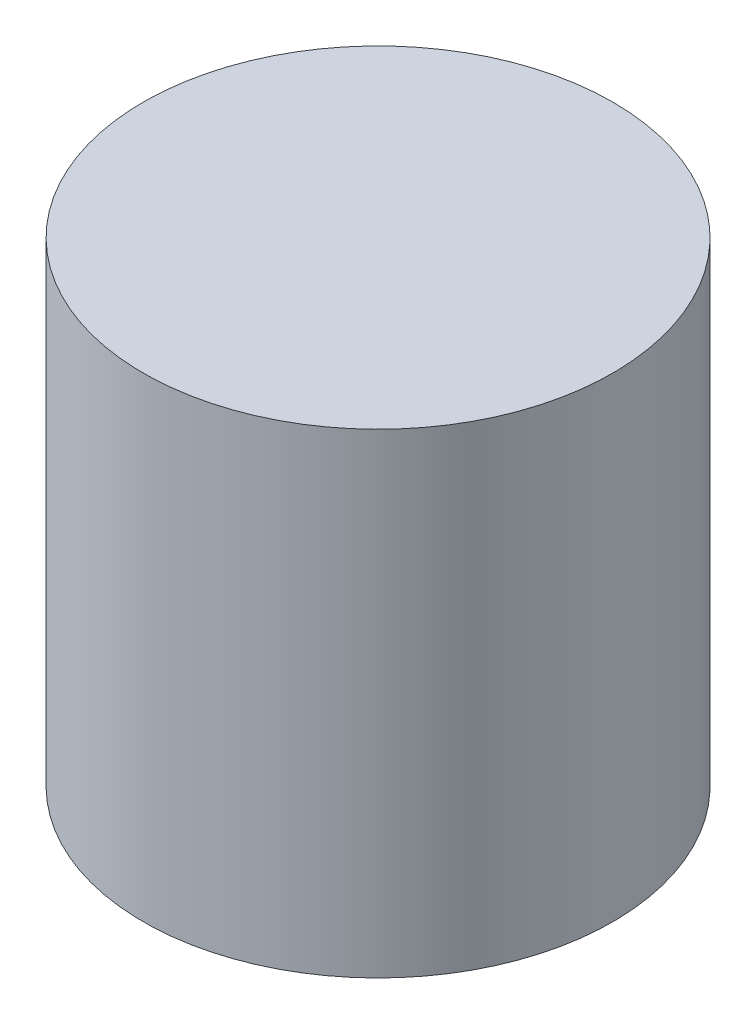
ISO-10303-21;
HEADER;
FILE_DESCRIPTION(('STEP AP214'),'2;1');
FILE_NAME('part.step','',(''),(''),'','','');
FILE_SCHEMA(('AUTOMOTIVE_DESIGN { 1 0 10303 214 1 1 1 1 }'));
ENDSEC;
DATA;
#1=APPLICATION_CONTEXT('core data for automotive mechanical design processes');
#2=APPLICATION_PROTOCOL_DEFINITION('international standard','automotive_design',2000,#1);
#3=PRODUCT_CONTEXT('',#1,'mechanical');
#4=PRODUCT('Part','Part','',(#3));
#5=PRODUCT_RELATED_PRODUCT_CATEGORY('part','',(#4));
#6=PRODUCT_DEFINITION_FORMATION('','',#4);
#7=PRODUCT_DEFINITION_CONTEXT('part definition',#1,'design');
#8=PRODUCT_DEFINITION('design','',#6,#7);
#9=PRODUCT_DEFINITION_SHAPE('','',#8);
#10=(LENGTH_UNIT() NAMED_UNIT(*) SI_UNIT(.MILLI.,.METRE.));
#11=(NAMED_UNIT(*) PLANE_ANGLE_UNIT() SI_UNIT($,.RADIAN.));
#12=(NAMED_UNIT(*) SI_UNIT($,.STERADIAN.) SOLID_ANGLE_UNIT());
#13=UNCERTAINTY_MEASURE_WITH_UNIT(LENGTH_MEASURE(1.E-05),#10,'distance_accuracy_value','');
#14=(GEOMETRIC_REPRESENTATION_CONTEXT(3) GLOBAL_UNCERTAINTY_ASSIGNED_CONTEXT((#13)) GLOBAL_UNIT_ASSIGNED_CONTEXT((#10,
#11,#12)) REPRESENTATION_CONTEXT('',''));
#15=CARTESIAN_POINT('',(0.,0.,0.));
#16=DIRECTION('',(0.,0.,1.));
#17=DIRECTION('',(1.,0.,0.));
#18=AXIS2_PLACEMENT_3D('',#15,#16,#17);
#19=CARTESIAN_POINT('',(0.,6.3246,0.));
#20=DIRECTION('',(0.,-1.,0.));
#21=DIRECTION('',(0.,0.,-1.));
#22=AXIS2_PLACEMENT_3D('',#19,#20,#21);
#23=CYLINDRICAL_SURFACE('',#22,3.1242);
#24=CARTESIAN_POINT('',(0.,6.3246,0.));
#25=DIRECTION('',(0.,1.,0.));
#26=DIRECTION('',(0.,0.,1.));
#27=AXIS2_PLACEMENT_3D('',#24,#25,#26);
#28=CIRCLE('',#27,3.1242);
#29=CARTESIAN_POINT('',(0.,6.3246,-3.1242));
#30=VERTEX_POINT('',#29);
#31=EDGE_CURVE('E10',#30,#30,#28,.T.);
#32=CARTESIAN_POINT('',(0.,0.,0.));
#33=DIRECTION('',(0.,1.,0.));
#34=DIRECTION('',(0.,0.,1.));
#35=AXIS2_PLACEMENT_3D('',#32,#33,#34);
#36=CIRCLE('',#35,3.1242);
#37=CARTESIAN_POINT('',(0.,0.,-3.1242));
#38=VERTEX_POINT('',#37);
#39=EDGE_CURVE('E35',#38,#38,#36,.T.);
#40=CARTESIAN_POINT('',(0.,6.3246,-3.1242));
#41=CARTESIAN_POINT('',(0.,6.25871875,-3.1242));
#42=CARTESIAN_POINT('',(0.,6.1928375,-3.1242));
#43=CARTESIAN_POINT('',(0.,6.061075,-3.1242));
#44=CARTESIAN_POINT('',(0.,5.99519375,-3.1242));
#45=CARTESIAN_POINT('',(0.,5.86343125,-3.1242));
#46=CARTESIAN_POINT('',(0.,5.79755,-3.1242));
#47=CARTESIAN_POINT('',(0.,5.6657875,-3.1242));
#48=CARTESIAN_POINT('',(0.,5.59990625,-3.1242));
#49=CARTESIAN_POINT('',(0.,5.46814375,-3.1242));
#50=CARTESIAN_POINT('',(0.,5.4022625,-3.1242));
#51=CARTESIAN_POINT('',(0.,5.2705,-3.1242));
#52=CARTESIAN_POINT('',(0.,5.20461875,-3.1242));
#53=CARTESIAN_POINT('',(0.,5.07285625,-3.1242));
#54=CARTESIAN_POINT('',(0.,5.006975,-3.1242));
#55=CARTESIAN_POINT('',(0.,4.8752125,-3.1242));
#56=CARTESIAN_POINT('',(0.,4.80933125,-3.1242));
#57=CARTESIAN_POINT('',(0.,4.67756875,-3.1242));
#58=CARTESIAN_POINT('',(0.,4.6116875,-3.1242));
#59=CARTESIAN_POINT('',(0.,4.479925,-3.1242));
#60=CARTESIAN_POINT('',(0.,4.41404375,-3.1242));
#61=CARTESIAN_POINT('',(0.,4.28228125,-3.1242));
#62=CARTESIAN_POINT('',(0.,4.2164,-3.1242));
#63=CARTESIAN_POINT('',(0.,4.0846375,-3.1242));
#64=CARTESIAN_POINT('',(0.,4.01875625,-3.1242));
#65=CARTESIAN_POINT('',(0.,3.88699375,-3.1242));
#66=CARTESIAN_POINT('',(0.,3.8211125,-3.1242));
#67=CARTESIAN_POINT('',(0.,3.68935,-3.1242));
#68=CARTESIAN_POINT('',(0.,3.62346875,-3.1242));
#69=CARTESIAN_POINT('',(0.,3.49170625,-3.1242));
#70=CARTESIAN_POINT('',(0.,3.425825,-3.1242));
#71=CARTESIAN_POINT('',(0.,3.2940625,-3.1242));
#72=CARTESIAN_POINT('',(0.,3.22818125,-3.1242));
#73=CARTESIAN_POINT('',(0.,3.09641875,-3.1242));
#74=CARTESIAN_POINT('',(0.,3.0305375,-3.1242));
#75=CARTESIAN_POINT('',(0.,2.898775,-3.1242));
#76=CARTESIAN_POINT('',(0.,2.83289375,-3.1242));
#77=CARTESIAN_POINT('',(0.,2.70113125,-3.1242));
#78=CARTESIAN_POINT('',(0.,2.63525,-3.1242));
#79=CARTESIAN_POINT('',(0.,2.5034875,-3.1242));
#80=CARTESIAN_POINT('',(0.,2.43760625,-3.1242));
#81=CARTESIAN_POINT('',(0.,2.30584375,-3.1242));
#82=CARTESIAN_POINT('',(0.,2.2399625,-3.1242));
#83=CARTESIAN_POINT('',(0.,2.1082,-3.1242));
#84=CARTESIAN_POINT('',(0.,2.04231875,-3.1242));
#85=CARTESIAN_POINT('',(0.,1.91055625,-3.1242));
#86=CARTESIAN_POINT('',(0.,1.844675,-3.1242));
#87=CARTESIAN_POINT('',(0.,1.7129125,-3.1242));
#88=CARTESIAN_POINT('',(0.,1.64703125,-3.1242));
#89=CARTESIAN_POINT('',(0.,1.51526875,-3.1242));
#90=CARTESIAN_POINT('',(0.,1.4493875,-3.1242));
#91=CARTESIAN_POINT('',(0.,1.317625,-3.1242));
#92=CARTESIAN_POINT('',(0.,1.25174375,-3.1242));
#93=CARTESIAN_POINT('',(0.,1.11998125,-3.1242));
#94=CARTESIAN_POINT('',(0.,1.0541,-3.1242));
#95=CARTESIAN_POINT('',(0.,0.9223375,-3.1242));
#96=CARTESIAN_POINT('',(0.,0.85645625,-3.1242));
#97=CARTESIAN_POINT('',(0.,0.72469375,-3.1242));
#98=CARTESIAN_POINT('',(0.,0.6588125,-3.1242));
#99=CARTESIAN_POINT('',(0.,0.52705,-3.1242));
#100=CARTESIAN_POINT('',(0.,0.46116875,-3.1242));
#101=CARTESIAN_POINT('',(0.,0.32940625,-3.1242));
#102=CARTESIAN_POINT('',(0.,0.263525,-3.1242));
#103=CARTESIAN_POINT('',(0.,0.1317625,-3.1242));
#104=CARTESIAN_POINT('',(0.,0.0658812500000001,-3.1242));
#105=CARTESIAN_POINT('',(0.,0.,-3.1242));
#106=B_SPLINE_CURVE_WITH_KNOTS('',3,(#40,#41,#42,#43,#44,#45,#46,#47,#48,#49,#50,#51,#52,#53,
#54,#55,#56,#57,#58,#59,#60,#61,#62,#63,#64,#65,#66,#67,#68,#69,#70,#71,#72,#73,#74,#75,#76,#77,
#78,#79,#80,#81,#82,#83,#84,#85,#86,#87,#88,#89,#90,#91,#92,#93,#94,#95,#96,#97,#98,#99,#100,
#101,#102,#103,#104,#105),.UNSPECIFIED.,.F.,.F.,(4,2,2,2,2,2,2,2,2,2,2,2,2,2,2,2,2,2,2,2,2,2,2,
2,2,2,2,2,2,2,2,2,4),(0.,0.19764375,0.395287500000001,0.59293125,0.790575000000001,0.98821875,
1.1858625,1.38350625,1.58115,1.77879375,1.9764375,2.17408125,2.371725,2.56936875,2.7670125,
2.96465625,3.1623,3.35994375,3.5575875,3.75523125,3.952875,4.15051875,4.3481625,4.54580625,
4.74345,4.94109375,5.1387375,5.33638125,5.534025,5.73166875,5.9293125,6.12695625,6.3246),.UNSPECIFIED.);
#107=EDGE_CURVE('BSEAM32',#30,#38,#106,.T.);
#108=ORIENTED_EDGE('',*,*,#31,.F.);
#109=ORIENTED_EDGE('',*,*,#39,.T.);
#110=ORIENTED_EDGE('',*,*,#107,.T.);
#111=ORIENTED_EDGE('',*,*,#107,.F.);
#112=EDGE_LOOP('',(#108,#110,#109,#111));
#113=FACE_BOUND('',#112,.T.);
#114=ADVANCED_FACE('F32',(#113),#23,.T.);
#115=CARTESIAN_POINT('',(0.,6.3246,0.));
#116=DIRECTION('',(0.,1.,0.));
#117=DIRECTION('',(0.,0.,1.));
#118=AXIS2_PLACEMENT_3D('',#115,#116,#117);
#119=PLANE('',#118);
#120=ORIENTED_EDGE('',*,*,#31,.T.);
#121=EDGE_LOOP('',(#120));
#122=FACE_BOUND('',#121,.T.);
#123=ADVANCED_FACE('F47',(#122),#119,.T.);
#124=CARTESIAN_POINT('',(0.,0.,0.));
#125=DIRECTION('',(0.,1.,0.));
#126=DIRECTION('',(0.,0.,1.));
#127=AXIS2_PLACEMENT_3D('',#124,#125,#126);
#128=PLANE('',#127);
#129=ORIENTED_EDGE('',*,*,#39,.F.);
#130=EDGE_LOOP('',(#129));
#131=FACE_BOUND('',#130,.T.);
#132=ADVANCED_FACE('F45',(#131),#128,.F.);
#133=CLOSED_SHELL('',(#114,#123,#132));
#134=MANIFOLD_SOLID_BREP('B2',#133);
#135=ADVANCED_BREP_SHAPE_REPRESENTATION('',(#18,#134),#14);
#136=SHAPE_DEFINITION_REPRESENTATION(#9,#135);
ENDSEC;
END-ISO-10303-21;
